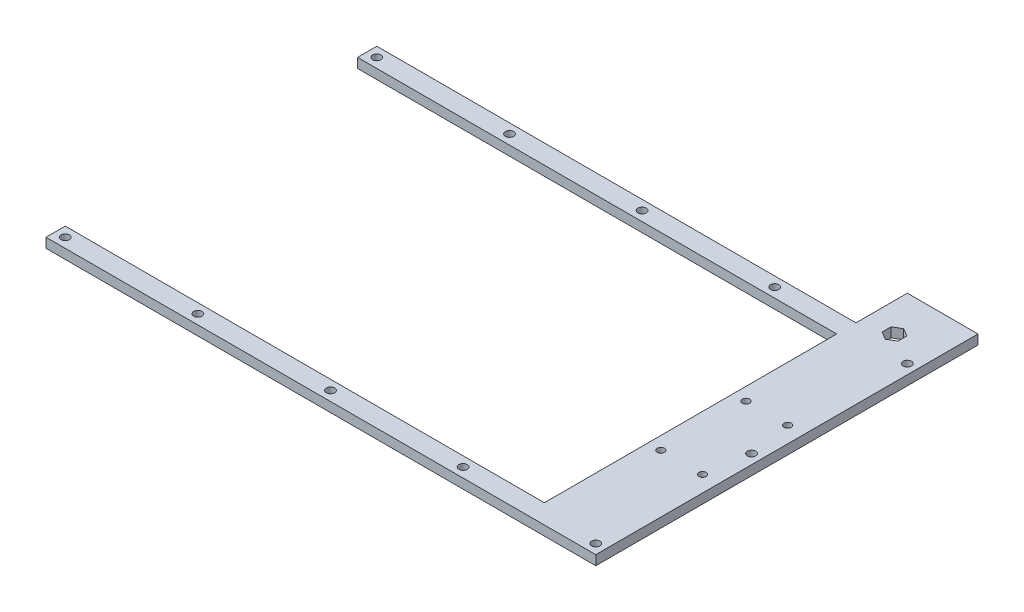
ISO-10303-21;
HEADER;
FILE_DESCRIPTION(('STEP AP214'),'2;1');
FILE_NAME('part.step','',(''),(''),'','','');
FILE_SCHEMA(('AUTOMOTIVE_DESIGN { 1 0 10303 214 1 1 1 1 }'));
ENDSEC;
DATA;
#1=APPLICATION_CONTEXT('core data for automotive mechanical design processes');
#2=APPLICATION_PROTOCOL_DEFINITION('international standard','automotive_design',2000,#1);
#3=PRODUCT_CONTEXT('',#1,'mechanical');
#4=PRODUCT('Part','Part','',(#3));
#5=PRODUCT_RELATED_PRODUCT_CATEGORY('part','',(#4));
#6=PRODUCT_DEFINITION_FORMATION('','',#4);
#7=PRODUCT_DEFINITION_CONTEXT('part definition',#1,'design');
#8=PRODUCT_DEFINITION('design','',#6,#7);
#9=PRODUCT_DEFINITION_SHAPE('','',#8);
#10=(LENGTH_UNIT() NAMED_UNIT(*) SI_UNIT(.MILLI.,.METRE.));
#11=(NAMED_UNIT(*) PLANE_ANGLE_UNIT() SI_UNIT($,.RADIAN.));
#12=(NAMED_UNIT(*) SI_UNIT($,.STERADIAN.) SOLID_ANGLE_UNIT());
#13=UNCERTAINTY_MEASURE_WITH_UNIT(LENGTH_MEASURE(1.E-05),#10,'distance_accuracy_value','');
#14=(GEOMETRIC_REPRESENTATION_CONTEXT(3) GLOBAL_UNCERTAINTY_ASSIGNED_CONTEXT((#13)) GLOBAL_UNIT_ASSIGNED_CONTEXT((#10,
#11,#12)) REPRESENTATION_CONTEXT('',''));
#15=CARTESIAN_POINT('',(0.,0.,0.));
#16=DIRECTION('',(0.,0.,1.));
#17=DIRECTION('',(1.,0.,0.));
#18=AXIS2_PLACEMENT_3D('',#15,#16,#17);
#19=CARTESIAN_POINT('',(49.9999999999999,-6.,109.921508101416));
#20=DIRECTION('',(0.,0.,1.));
#21=DIRECTION('',(1.,0.,0.));
#22=AXIS2_PLACEMENT_3D('',#19,#20,#21);
#23=PLANE('',#22);
#24=DIRECTION('',(0.,1.,0.));
#25=VECTOR('',#24,1.);
#26=CARTESIAN_POINT('',(5.99999999999987,-6.,109.921508101416));
#27=LINE('',#26,#25);
#28=CARTESIAN_POINT('',(5.99999999999987,-6.,109.921508101416));
#29=VERTEX_POINT('',#28);
#30=CARTESIAN_POINT('',(5.99999999999987,0.,109.921508101416));
#31=VERTEX_POINT('',#30);
#32=EDGE_CURVE('E221',#29,#31,#27,.T.);
#33=ORIENTED_EDGE('',*,*,#32,.F.);
#34=DIRECTION('',(-1.,0.,0.));
#35=VECTOR('',#34,1.);
#36=CARTESIAN_POINT('',(49.9999999999999,-6.,109.921508101416));
#37=LINE('',#36,#35);
#38=CARTESIAN_POINT('',(-292.3,-6.,109.921508101416));
#39=VERTEX_POINT('',#38);
#40=EDGE_CURVE('E308',#29,#39,#37,.T.);
#41=ORIENTED_EDGE('',*,*,#40,.T.);
#42=DIRECTION('',(0.,1.,0.));
#43=VECTOR('',#42,1.);
#44=CARTESIAN_POINT('',(-292.3,-6.,109.921508101416));
#45=LINE('',#44,#43);
#46=CARTESIAN_POINT('',(-292.3,0.,109.921508101416));
#47=VERTEX_POINT('',#46);
#48=EDGE_CURVE('E334',#39,#47,#45,.T.);
#49=ORIENTED_EDGE('',*,*,#48,.T.);
#50=DIRECTION('',(1.,0.,0.));
#51=VECTOR('',#50,1.);
#52=CARTESIAN_POINT('',(49.9999999999999,0.,109.921508101416));
#53=LINE('',#52,#51);
#54=EDGE_CURVE('E335',#47,#31,#53,.T.);
#55=ORIENTED_EDGE('',*,*,#54,.T.);
#56=EDGE_LOOP('',(#33,#41,#49,#55));
#57=FACE_BOUND('',#56,.T.);
#58=ADVANCED_FACE('F41',(#57),#23,.F.);
#59=CARTESIAN_POINT('',(0.,0.,0.));
#60=DIRECTION('',(0.,-1.,0.));
#61=DIRECTION('',(0.,0.,-1.));
#62=AXIS2_PLACEMENT_3D('',#59,#60,#61);
#63=PLANE('',#62);
#64=DIRECTION('',(0.866025403784444,0.,-0.49999999999999));
#65=VECTOR('',#64,1.);
#66=CARTESIAN_POINT('',(28.9099999999998,0.,106.756297923137));
#67=LINE('',#66,#65);
#68=CARTESIAN_POINT('',(23.9999999999998,0.,109.591087744858));
#69=VERTEX_POINT('',#68);
#70=CARTESIAN_POINT('',(28.9099999999998,0.,106.756297923137));
#71=VERTEX_POINT('',#70);
#72=EDGE_CURVE('E189',#69,#71,#67,.T.);
#73=ORIENTED_EDGE('',*,*,#72,.F.);
#74=DIRECTION('',(0.866025403784439,0.,0.499999999999999));
#75=VECTOR('',#74,1.);
#76=CARTESIAN_POINT('',(23.9999999999998,0.,109.591087744858));
#77=LINE('',#76,#75);
#78=CARTESIAN_POINT('',(19.0899999999998,0.,106.756297923137));
#79=VERTEX_POINT('',#78);
#80=EDGE_CURVE('E58',#79,#69,#77,.T.);
#81=ORIENTED_EDGE('',*,*,#80,.F.);
#82=DIRECTION('',(0.,0.,1.));
#83=VECTOR('',#82,1.);
#84=CARTESIAN_POINT('',(19.0899999999998,0.,106.756297923137));
#85=LINE('',#84,#83);
#86=CARTESIAN_POINT('',(19.0899999999998,0.,101.086718279695));
#87=VERTEX_POINT('',#86);
#88=EDGE_CURVE('E175',#87,#79,#85,.T.);
#89=ORIENTED_EDGE('',*,*,#88,.F.);
#90=DIRECTION('',(-0.86602540378444,0.,0.499999999999998));
#91=VECTOR('',#90,1.);
#92=CARTESIAN_POINT('',(19.0899999999998,0.,101.086718279695));
#93=LINE('',#92,#91);
#94=CARTESIAN_POINT('',(23.9999999999999,0.,98.2519284579738));
#95=VERTEX_POINT('',#94);
#96=EDGE_CURVE('E178',#95,#87,#93,.T.);
#97=ORIENTED_EDGE('',*,*,#96,.F.);
#98=DIRECTION('',(-0.866025403784434,0.,-0.500000000000009));
#99=VECTOR('',#98,1.);
#100=CARTESIAN_POINT('',(23.9999999999999,0.,98.2519284579738));
#101=LINE('',#100,#99);
#102=CARTESIAN_POINT('',(28.9099999999998,0.,101.086718279695));
#103=VERTEX_POINT('',#102);
#104=EDGE_CURVE('E194',#103,#95,#101,.T.);
#105=ORIENTED_EDGE('',*,*,#104,.F.);
#106=DIRECTION('',(0.,0.,-1.));
#107=VECTOR('',#106,1.);
#108=CARTESIAN_POINT('',(28.9099999999998,0.,101.086718279695));
#109=LINE('',#108,#107);
#110=EDGE_CURVE('E191',#71,#103,#109,.T.);
#111=ORIENTED_EDGE('',*,*,#110,.F.);
#112=EDGE_LOOP('',(#73,#81,#89,#97,#105,#111));
#113=FACE_BOUND('',#112,.T.);
#114=CARTESIAN_POINT('',(-286.3,0.,115.921508101416));
#115=DIRECTION('',(0.,1.,0.));
#116=DIRECTION('',(0.,0.,1.));
#117=AXIS2_PLACEMENT_3D('',#114,#115,#116);
#118=CIRCLE('',#117,2.59999999999999);
#119=CARTESIAN_POINT('',(-286.3,0.,118.521508101416));
#120=VERTEX_POINT('',#119);
#121=EDGE_CURVE('E224',#120,#120,#118,.T.);
#122=ORIENTED_EDGE('',*,*,#121,.F.);
#123=EDGE_LOOP('',(#122));
#124=FACE_BOUND('',#123,.T.);
#125=CARTESIAN_POINT('',(-203.725,0.,115.921508101416));
#126=DIRECTION('',(0.,1.,0.));
#127=DIRECTION('',(0.,0.,1.));
#128=AXIS2_PLACEMENT_3D('',#125,#126,#127);
#129=CIRCLE('',#128,2.59999999999999);
#130=CARTESIAN_POINT('',(-203.725,0.,118.521508101416));
#131=VERTEX_POINT('',#130);
#132=EDGE_CURVE('E234',#131,#131,#129,.T.);
#133=ORIENTED_EDGE('',*,*,#132,.F.);
#134=EDGE_LOOP('',(#133));
#135=FACE_BOUND('',#134,.T.);
#136=CARTESIAN_POINT('',(-121.15,0.,115.921508101416));
#137=DIRECTION('',(0.,1.,0.));
#138=DIRECTION('',(0.,0.,1.));
#139=AXIS2_PLACEMENT_3D('',#136,#137,#138);
#140=CIRCLE('',#139,2.6);
#141=CARTESIAN_POINT('',(-121.15,0.,118.521508101416));
#142=VERTEX_POINT('',#141);
#143=EDGE_CURVE('E240',#142,#142,#140,.T.);
#144=ORIENTED_EDGE('',*,*,#143,.F.);
#145=EDGE_LOOP('',(#144));
#146=FACE_BOUND('',#145,.T.);
#147=CARTESIAN_POINT('',(-38.575,0.,115.921508101416));
#148=DIRECTION('',(0.,1.,0.));
#149=DIRECTION('',(0.,0.,1.));
#150=AXIS2_PLACEMENT_3D('',#147,#148,#149);
#151=CIRCLE('',#150,2.6);
#152=CARTESIAN_POINT('',(-38.575,0.,118.521508101416));
#153=VERTEX_POINT('',#152);
#154=EDGE_CURVE('E246',#153,#153,#151,.T.);
#155=ORIENTED_EDGE('',*,*,#154,.F.);
#156=EDGE_LOOP('',(#155));
#157=FACE_BOUND('',#156,.T.);
#158=CARTESIAN_POINT('',(44.0000000000001,0.,115.921508101416));
#159=DIRECTION('',(0.,1.,0.));
#160=DIRECTION('',(0.,0.,1.));
#161=AXIS2_PLACEMENT_3D('',#158,#159,#160);
#162=CIRCLE('',#161,2.6);
#163=CARTESIAN_POINT('',(44.0000000000001,0.,118.521508101416));
#164=VERTEX_POINT('',#163);
#165=EDGE_CURVE('E252',#164,#164,#162,.T.);
#166=ORIENTED_EDGE('',*,*,#165,.F.);
#167=EDGE_LOOP('',(#166));
#168=FACE_BOUND('',#167,.T.);
#169=CARTESIAN_POINT('',(43.9999999999998,0.,309.921508101416));
#170=DIRECTION('',(0.,1.,0.));
#171=DIRECTION('',(0.,0.,1.));
#172=AXIS2_PLACEMENT_3D('',#169,#170,#171);
#173=CIRCLE('',#172,2.6);
#174=CARTESIAN_POINT('',(43.9999999999998,0.,312.521508101416));
#175=VERTEX_POINT('',#174);
#176=EDGE_CURVE('E258',#175,#175,#173,.T.);
#177=ORIENTED_EDGE('',*,*,#176,.F.);
#178=EDGE_LOOP('',(#177));
#179=FACE_BOUND('',#178,.T.);
#180=CARTESIAN_POINT('',(-38.5750000000002,0.,309.921508101416));
#181=DIRECTION('',(0.,1.,0.));
#182=DIRECTION('',(0.,0.,1.));
#183=AXIS2_PLACEMENT_3D('',#180,#181,#182);
#184=CIRCLE('',#183,2.6);
#185=CARTESIAN_POINT('',(-38.5750000000002,0.,312.521508101416));
#186=VERTEX_POINT('',#185);
#187=EDGE_CURVE('E264',#186,#186,#184,.T.);
#188=ORIENTED_EDGE('',*,*,#187,.F.);
#189=EDGE_LOOP('',(#188));
#190=FACE_BOUND('',#189,.T.);
#191=CARTESIAN_POINT('',(-121.15,0.,309.921508101416));
#192=DIRECTION('',(0.,1.,0.));
#193=DIRECTION('',(0.,0.,1.));
#194=AXIS2_PLACEMENT_3D('',#191,#192,#193);
#195=CIRCLE('',#194,2.6);
#196=CARTESIAN_POINT('',(-121.15,0.,312.521508101416));
#197=VERTEX_POINT('',#196);
#198=EDGE_CURVE('E270',#197,#197,#195,.T.);
#199=ORIENTED_EDGE('',*,*,#198,.F.);
#200=EDGE_LOOP('',(#199));
#201=FACE_BOUND('',#200,.T.);
#202=CARTESIAN_POINT('',(-203.725,0.,309.921508101416));
#203=DIRECTION('',(0.,1.,0.));
#204=DIRECTION('',(0.,0.,1.));
#205=AXIS2_PLACEMENT_3D('',#202,#203,#204);
#206=CIRCLE('',#205,2.59999999999999);
#207=CARTESIAN_POINT('',(-203.725,0.,312.521508101416));
#208=VERTEX_POINT('',#207);
#209=EDGE_CURVE('E276',#208,#208,#206,.T.);
#210=ORIENTED_EDGE('',*,*,#209,.F.);
#211=EDGE_LOOP('',(#210));
#212=FACE_BOUND('',#211,.T.);
#213=CARTESIAN_POINT('',(-286.3,0.,309.921508101416));
#214=DIRECTION('',(0.,1.,0.));
#215=DIRECTION('',(0.,0.,1.));
#216=AXIS2_PLACEMENT_3D('',#213,#214,#215);
#217=CIRCLE('',#216,2.59999999999999);
#218=CARTESIAN_POINT('',(-286.3,0.,312.521508101416));
#219=VERTEX_POINT('',#218);
#220=EDGE_CURVE('E282',#219,#219,#217,.T.);
#221=ORIENTED_EDGE('',*,*,#220,.F.);
#222=EDGE_LOOP('',(#221));
#223=FACE_BOUND('',#222,.T.);
#224=CARTESIAN_POINT('',(43.9999999999998,0.,212.921508101416));
#225=DIRECTION('',(0.,1.,0.));
#226=DIRECTION('',(0.,0.,1.));
#227=AXIS2_PLACEMENT_3D('',#224,#225,#226);
#228=CIRCLE('',#227,2.6);
#229=CARTESIAN_POINT('',(43.9999999999998,0.,215.521508101416));
#230=VERTEX_POINT('',#229);
#231=EDGE_CURVE('E288',#230,#230,#228,.T.);
#232=ORIENTED_EDGE('',*,*,#231,.F.);
#233=EDGE_LOOP('',(#232));
#234=FACE_BOUND('',#233,.T.);
#235=CARTESIAN_POINT('',(39.9999999999999,0.,239.421508101416));
#236=DIRECTION('',(0.,-1.,0.));
#237=DIRECTION('',(0.,0.,-1.));
#238=AXIS2_PLACEMENT_3D('',#235,#236,#237);
#239=CIRCLE('',#238,2.25);
#240=CARTESIAN_POINT('',(39.9999999999999,0.,237.171508101416));
#241=VERTEX_POINT('',#240);
#242=EDGE_CURVE('E304',#241,#241,#239,.F.);
#243=ORIENTED_EDGE('',*,*,#242,.F.);
#244=EDGE_LOOP('',(#243));
#245=FACE_BOUND('',#244,.T.);
#246=CARTESIAN_POINT('',(13.9999999999999,0.,186.421508101416));
#247=DIRECTION('',(0.,-1.,0.));
#248=DIRECTION('',(0.,0.,-1.));
#249=AXIS2_PLACEMENT_3D('',#246,#247,#248);
#250=CIRCLE('',#249,2.25);
#251=CARTESIAN_POINT('',(13.9999999999999,0.,184.171508101416));
#252=VERTEX_POINT('',#251);
#253=EDGE_CURVE('E313',#252,#252,#250,.F.);
#254=ORIENTED_EDGE('',*,*,#253,.F.);
#255=EDGE_LOOP('',(#254));
#256=FACE_BOUND('',#255,.T.);
#257=CARTESIAN_POINT('',(13.9999999999999,0.,239.421508101416));
#258=DIRECTION('',(0.,-1.,0.));
#259=DIRECTION('',(0.,0.,-1.));
#260=AXIS2_PLACEMENT_3D('',#257,#258,#259);
#261=CIRCLE('',#260,2.25);
#262=CARTESIAN_POINT('',(13.9999999999999,0.,237.171508101416));
#263=VERTEX_POINT('',#262);
#264=EDGE_CURVE('E317',#263,#263,#261,.F.);
#265=ORIENTED_EDGE('',*,*,#264,.F.);
#266=EDGE_LOOP('',(#265));
#267=FACE_BOUND('',#266,.T.);
#268=CARTESIAN_POINT('',(39.9999999999999,0.,186.421508101416));
#269=DIRECTION('',(0.,-1.,0.));
#270=DIRECTION('',(0.,0.,-1.));
#271=AXIS2_PLACEMENT_3D('',#268,#269,#270);
#272=CIRCLE('',#271,2.25);
#273=CARTESIAN_POINT('',(39.9999999999999,0.,184.171508101416));
#274=VERTEX_POINT('',#273);
#275=EDGE_CURVE('E309',#274,#274,#272,.F.);
#276=ORIENTED_EDGE('',*,*,#275,.F.);
#277=EDGE_LOOP('',(#276));
#278=FACE_BOUND('',#277,.T.);
#279=DIRECTION('',(-1.,0.,0.));
#280=VECTOR('',#279,1.);
#281=CARTESIAN_POINT('',(49.9999999999999,0.,315.921508101416));
#282=LINE('',#281,#280);
#283=CARTESIAN_POINT('',(49.9999999999999,0.,315.921508101416));
#284=VERTEX_POINT('',#283);
#285=CARTESIAN_POINT('',(-292.3,0.,315.921508101416));
#286=VERTEX_POINT('',#285);
#287=EDGE_CURVE('E11',#284,#286,#282,.T.);
#288=ORIENTED_EDGE('',*,*,#287,.F.);
#289=DIRECTION('',(0.,0.,1.));
#290=VECTOR('',#289,1.);
#291=CARTESIAN_POINT('',(49.9999999999999,0.,77.9215081014159));
#292=LINE('',#291,#290);
#293=CARTESIAN_POINT('',(49.9999999999999,0.,77.9215081014159));
#294=VERTEX_POINT('',#293);
#295=EDGE_CURVE('E301',#294,#284,#292,.T.);
#296=ORIENTED_EDGE('',*,*,#295,.F.);
#297=DIRECTION('',(-1.,0.,0.));
#298=VECTOR('',#297,1.);
#299=CARTESIAN_POINT('',(49.9999999999999,0.,77.9215081014159));
#300=LINE('',#299,#298);
#301=CARTESIAN_POINT('',(5.99999999999987,0.,77.9215081014159));
#302=VERTEX_POINT('',#301);
#303=EDGE_CURVE('E201',#294,#302,#300,.T.);
#304=ORIENTED_EDGE('',*,*,#303,.T.);
#305=DIRECTION('',(0.,0.,1.));
#306=VECTOR('',#305,1.);
#307=CARTESIAN_POINT('',(5.99999999999987,0.,109.921508101416));
#308=LINE('',#307,#306);
#309=EDGE_CURVE('E213',#302,#31,#308,.T.);
#310=ORIENTED_EDGE('',*,*,#309,.T.);
#311=ORIENTED_EDGE('',*,*,#54,.F.);
#312=DIRECTION('',(0.,0.,-1.));
#313=VECTOR('',#312,1.);
#314=CARTESIAN_POINT('',(-292.3,0.,77.9215081014159));
#315=LINE('',#314,#313);
#316=CARTESIAN_POINT('',(-292.3,0.,121.921508101416));
#317=VERTEX_POINT('',#316);
#318=EDGE_CURVE('E298',#317,#47,#315,.T.);
#319=ORIENTED_EDGE('',*,*,#318,.F.);
#320=DIRECTION('',(-1.,0.,0.));
#321=VECTOR('',#320,1.);
#322=CARTESIAN_POINT('',(5.99999999999995,0.,121.921508101416));
#323=LINE('',#322,#321);
#324=CARTESIAN_POINT('',(5.99999999999995,0.,121.921508101416));
#325=VERTEX_POINT('',#324);
#326=EDGE_CURVE('E337',#325,#317,#323,.T.);
#327=ORIENTED_EDGE('',*,*,#326,.F.);
#328=DIRECTION('',(0.,0.,-1.));
#329=VECTOR('',#328,1.);
#330=CARTESIAN_POINT('',(5.99999999999987,0.,303.921508101416));
#331=LINE('',#330,#329);
#332=CARTESIAN_POINT('',(5.99999999999987,0.,303.921508101416));
#333=VERTEX_POINT('',#332);
#334=EDGE_CURVE('E340',#333,#325,#331,.T.);
#335=ORIENTED_EDGE('',*,*,#334,.F.);
#336=DIRECTION('',(1.,0.,0.));
#337=VECTOR('',#336,1.);
#338=CARTESIAN_POINT('',(5.99999999999987,0.,303.921508101416));
#339=LINE('',#338,#337);
#340=CARTESIAN_POINT('',(-292.3,0.,303.921508101416));
#341=VERTEX_POINT('',#340);
#342=EDGE_CURVE('E50',#341,#333,#339,.T.);
#343=ORIENTED_EDGE('',*,*,#342,.F.);
#344=DIRECTION('',(0.,0.,-1.));
#345=VECTOR('',#344,1.);
#346=CARTESIAN_POINT('',(-292.3,0.,297.921508101416));
#347=LINE('',#346,#345);
#348=EDGE_CURVE('E294',#286,#341,#347,.T.);
#349=ORIENTED_EDGE('',*,*,#348,.F.);
#350=EDGE_LOOP('',(#288,#296,#304,#310,#311,#319,#327,#335,#343,#349));
#351=FACE_BOUND('',#350,.T.);
#352=ADVANCED_FACE('F397',(#113,#124,#135,#146,#157,#168,#179,#190,#201,#212,#223,#234,#245,
#256,#267,#278,#351),#63,.F.);
#353=CARTESIAN_POINT('',(0.,-6.,0.));
#354=DIRECTION('',(0.,1.,0.));
#355=DIRECTION('',(0.,0.,1.));
#356=AXIS2_PLACEMENT_3D('',#353,#354,#355);
#357=PLANE('',#356);
#358=DIRECTION('',(0.,0.,1.));
#359=VECTOR('',#358,1.);
#360=CARTESIAN_POINT('',(19.0899999999998,-6.00000000000001,106.756297923137));
#361=LINE('',#360,#359);
#362=CARTESIAN_POINT('',(19.0899999999998,-6.00000000000001,101.086718279695));
#363=VERTEX_POINT('',#362);
#364=CARTESIAN_POINT('',(19.0899999999998,-6.00000000000001,106.756297923137));
#365=VERTEX_POINT('',#364);
#366=EDGE_CURVE('E164',#363,#365,#361,.T.);
#367=ORIENTED_EDGE('',*,*,#366,.T.);
#368=DIRECTION('',(0.866025403784439,0.,0.499999999999999));
#369=VECTOR('',#368,1.);
#370=CARTESIAN_POINT('',(23.9999999999998,-6.00000000000001,109.591087744858));
#371=LINE('',#370,#369);
#372=CARTESIAN_POINT('',(23.9999999999998,-6.00000000000001,109.591087744858));
#373=VERTEX_POINT('',#372);
#374=EDGE_CURVE('E158',#365,#373,#371,.T.);
#375=ORIENTED_EDGE('',*,*,#374,.T.);
#376=DIRECTION('',(0.866025403784444,0.,-0.49999999999999));
#377=VECTOR('',#376,1.);
#378=CARTESIAN_POINT('',(28.9099999999998,-6.00000000000001,106.756297923137));
#379=LINE('',#378,#377);
#380=CARTESIAN_POINT('',(28.9099999999998,-6.,106.756297923137));
#381=VERTEX_POINT('',#380);
#382=EDGE_CURVE('E167',#373,#381,#379,.T.);
#383=ORIENTED_EDGE('',*,*,#382,.T.);
#384=DIRECTION('',(0.,0.,-1.));
#385=VECTOR('',#384,1.);
#386=CARTESIAN_POINT('',(28.9099999999998,-6.00000000000001,101.086718279695));
#387=LINE('',#386,#385);
#388=CARTESIAN_POINT('',(28.9099999999998,-6.00000000000001,101.086718279695));
#389=VERTEX_POINT('',#388);
#390=EDGE_CURVE('E66',#381,#389,#387,.T.);
#391=ORIENTED_EDGE('',*,*,#390,.T.);
#392=DIRECTION('',(-0.866025403784434,0.,-0.500000000000009));
#393=VECTOR('',#392,1.);
#394=CARTESIAN_POINT('',(23.9999999999999,-6.00000000000001,98.2519284579738));
#395=LINE('',#394,#393);
#396=CARTESIAN_POINT('',(23.9999999999999,-6.00000000000001,98.2519284579738));
#397=VERTEX_POINT('',#396);
#398=EDGE_CURVE('E182',#389,#397,#395,.T.);
#399=ORIENTED_EDGE('',*,*,#398,.T.);
#400=DIRECTION('',(-0.86602540378444,0.,0.499999999999998));
#401=VECTOR('',#400,1.);
#402=CARTESIAN_POINT('',(19.0899999999998,-6.00000000000001,101.086718279695));
#403=LINE('',#402,#401);
#404=EDGE_CURVE('E185',#397,#363,#403,.T.);
#405=ORIENTED_EDGE('',*,*,#404,.T.);
#406=EDGE_LOOP('',(#367,#375,#383,#391,#399,#405));
#407=FACE_BOUND('',#406,.T.);
#408=CARTESIAN_POINT('',(-286.3,-6.00000000000001,115.921508101416));
#409=DIRECTION('',(0.,1.,0.));
#410=DIRECTION('',(0.,0.,1.));
#411=AXIS2_PLACEMENT_3D('',#408,#409,#410);
#412=CIRCLE('',#411,2.59999999999999);
#413=CARTESIAN_POINT('',(-286.3,-6.00000000000001,118.521508101416));
#414=VERTEX_POINT('',#413);
#415=EDGE_CURVE('E231',#414,#414,#412,.T.);
#416=ORIENTED_EDGE('',*,*,#415,.T.);
#417=EDGE_LOOP('',(#416));
#418=FACE_BOUND('',#417,.T.);
#419=CARTESIAN_POINT('',(-203.725,-6.00000000000001,115.921508101416));
#420=DIRECTION('',(0.,1.,0.));
#421=DIRECTION('',(0.,0.,1.));
#422=AXIS2_PLACEMENT_3D('',#419,#420,#421);
#423=CIRCLE('',#422,2.59999999999999);
#424=CARTESIAN_POINT('',(-203.725,-6.00000000000001,118.521508101416));
#425=VERTEX_POINT('',#424);
#426=EDGE_CURVE('E237',#425,#425,#423,.T.);
#427=ORIENTED_EDGE('',*,*,#426,.T.);
#428=EDGE_LOOP('',(#427));
#429=FACE_BOUND('',#428,.T.);
#430=CARTESIAN_POINT('',(-121.15,-6.00000000000001,115.921508101416));
#431=DIRECTION('',(0.,1.,0.));
#432=DIRECTION('',(0.,0.,1.));
#433=AXIS2_PLACEMENT_3D('',#430,#431,#432);
#434=CIRCLE('',#433,2.6);
#435=CARTESIAN_POINT('',(-121.15,-6.00000000000001,118.521508101416));
#436=VERTEX_POINT('',#435);
#437=EDGE_CURVE('E243',#436,#436,#434,.T.);
#438=ORIENTED_EDGE('',*,*,#437,.T.);
#439=EDGE_LOOP('',(#438));
#440=FACE_BOUND('',#439,.T.);
#441=CARTESIAN_POINT('',(-38.575,-6.00000000000001,115.921508101416));
#442=DIRECTION('',(0.,1.,0.));
#443=DIRECTION('',(0.,0.,1.));
#444=AXIS2_PLACEMENT_3D('',#441,#442,#443);
#445=CIRCLE('',#444,2.6);
#446=CARTESIAN_POINT('',(-38.575,-6.00000000000001,118.521508101416));
#447=VERTEX_POINT('',#446);
#448=EDGE_CURVE('E249',#447,#447,#445,.T.);
#449=ORIENTED_EDGE('',*,*,#448,.T.);
#450=EDGE_LOOP('',(#449));
#451=FACE_BOUND('',#450,.T.);
#452=CARTESIAN_POINT('',(44.0000000000001,-6.00000000000001,115.921508101416));
#453=DIRECTION('',(0.,1.,0.));
#454=DIRECTION('',(0.,0.,1.));
#455=AXIS2_PLACEMENT_3D('',#452,#453,#454);
#456=CIRCLE('',#455,2.6);
#457=CARTESIAN_POINT('',(44.0000000000001,-6.00000000000001,118.521508101416));
#458=VERTEX_POINT('',#457);
#459=EDGE_CURVE('E255',#458,#458,#456,.T.);
#460=ORIENTED_EDGE('',*,*,#459,.T.);
#461=EDGE_LOOP('',(#460));
#462=FACE_BOUND('',#461,.T.);
#463=CARTESIAN_POINT('',(43.9999999999998,-6.00000000000001,309.921508101416));
#464=DIRECTION('',(0.,1.,0.));
#465=DIRECTION('',(0.,0.,1.));
#466=AXIS2_PLACEMENT_3D('',#463,#464,#465);
#467=CIRCLE('',#466,2.6);
#468=CARTESIAN_POINT('',(43.9999999999998,-6.00000000000001,312.521508101416));
#469=VERTEX_POINT('',#468);
#470=EDGE_CURVE('E261',#469,#469,#467,.T.);
#471=ORIENTED_EDGE('',*,*,#470,.T.);
#472=EDGE_LOOP('',(#471));
#473=FACE_BOUND('',#472,.T.);
#474=CARTESIAN_POINT('',(-38.5750000000002,-6.00000000000001,309.921508101416));
#475=DIRECTION('',(0.,1.,0.));
#476=DIRECTION('',(0.,0.,1.));
#477=AXIS2_PLACEMENT_3D('',#474,#475,#476);
#478=CIRCLE('',#477,2.6);
#479=CARTESIAN_POINT('',(-38.5750000000002,-6.00000000000001,312.521508101416));
#480=VERTEX_POINT('',#479);
#481=EDGE_CURVE('E267',#480,#480,#478,.T.);
#482=ORIENTED_EDGE('',*,*,#481,.T.);
#483=EDGE_LOOP('',(#482));
#484=FACE_BOUND('',#483,.T.);
#485=CARTESIAN_POINT('',(-121.15,-6.00000000000001,309.921508101416));
#486=DIRECTION('',(0.,1.,0.));
#487=DIRECTION('',(0.,0.,1.));
#488=AXIS2_PLACEMENT_3D('',#485,#486,#487);
#489=CIRCLE('',#488,2.6);
#490=CARTESIAN_POINT('',(-121.15,-6.00000000000001,312.521508101416));
#491=VERTEX_POINT('',#490);
#492=EDGE_CURVE('E273',#491,#491,#489,.T.);
#493=ORIENTED_EDGE('',*,*,#492,.T.);
#494=EDGE_LOOP('',(#493));
#495=FACE_BOUND('',#494,.T.);
#496=CARTESIAN_POINT('',(-203.725,-6.00000000000001,309.921508101416));
#497=DIRECTION('',(0.,1.,0.));
#498=DIRECTION('',(0.,0.,1.));
#499=AXIS2_PLACEMENT_3D('',#496,#497,#498);
#500=CIRCLE('',#499,2.59999999999999);
#501=CARTESIAN_POINT('',(-203.725,-6.00000000000001,312.521508101416));
#502=VERTEX_POINT('',#501);
#503=EDGE_CURVE('E279',#502,#502,#500,.T.);
#504=ORIENTED_EDGE('',*,*,#503,.T.);
#505=EDGE_LOOP('',(#504));
#506=FACE_BOUND('',#505,.T.);
#507=CARTESIAN_POINT('',(-286.3,-6.00000000000001,309.921508101416));
#508=DIRECTION('',(0.,1.,0.));
#509=DIRECTION('',(0.,0.,1.));
#510=AXIS2_PLACEMENT_3D('',#507,#508,#509);
#511=CIRCLE('',#510,2.59999999999999);
#512=CARTESIAN_POINT('',(-286.3,-6.00000000000001,312.521508101416));
#513=VERTEX_POINT('',#512);
#514=EDGE_CURVE('E285',#513,#513,#511,.T.);
#515=ORIENTED_EDGE('',*,*,#514,.T.);
#516=EDGE_LOOP('',(#515));
#517=FACE_BOUND('',#516,.T.);
#518=CARTESIAN_POINT('',(43.9999999999998,-6.00000000000001,212.921508101416));
#519=DIRECTION('',(0.,1.,0.));
#520=DIRECTION('',(0.,0.,1.));
#521=AXIS2_PLACEMENT_3D('',#518,#519,#520);
#522=CIRCLE('',#521,2.6);
#523=CARTESIAN_POINT('',(43.9999999999998,-6.00000000000001,215.521508101416));
#524=VERTEX_POINT('',#523);
#525=EDGE_CURVE('E291',#524,#524,#522,.T.);
#526=ORIENTED_EDGE('',*,*,#525,.T.);
#527=EDGE_LOOP('',(#526));
#528=FACE_BOUND('',#527,.T.);
#529=CARTESIAN_POINT('',(39.9999999999999,-6.,239.421508101416));
#530=DIRECTION('',(0.,1.,0.));
#531=DIRECTION('',(0.,0.,1.));
#532=AXIS2_PLACEMENT_3D('',#529,#530,#531);
#533=CIRCLE('',#532,2.25);
#534=CARTESIAN_POINT('',(39.9999999999999,-6.,241.671508101416));
#535=VERTEX_POINT('',#534);
#536=EDGE_CURVE('E307',#535,#535,#533,.F.);
#537=ORIENTED_EDGE('',*,*,#536,.F.);
#538=EDGE_LOOP('',(#537));
#539=FACE_BOUND('',#538,.T.);
#540=CARTESIAN_POINT('',(13.9999999999999,-6.,186.421508101416));
#541=DIRECTION('',(0.,1.,0.));
#542=DIRECTION('',(0.,0.,1.));
#543=AXIS2_PLACEMENT_3D('',#540,#541,#542);
#544=CIRCLE('',#543,2.25);
#545=CARTESIAN_POINT('',(13.9999999999999,-6.,188.671508101416));
#546=VERTEX_POINT('',#545);
#547=EDGE_CURVE('E316',#546,#546,#544,.F.);
#548=ORIENTED_EDGE('',*,*,#547,.F.);
#549=EDGE_LOOP('',(#548));
#550=FACE_BOUND('',#549,.T.);
#551=CARTESIAN_POINT('',(13.9999999999999,-6.,239.421508101416));
#552=DIRECTION('',(0.,1.,0.));
#553=DIRECTION('',(0.,0.,1.));
#554=AXIS2_PLACEMENT_3D('',#551,#552,#553);
#555=CIRCLE('',#554,2.25);
#556=CARTESIAN_POINT('',(13.9999999999999,-6.,241.671508101416));
#557=VERTEX_POINT('',#556);
#558=EDGE_CURVE('E320',#557,#557,#555,.F.);
#559=ORIENTED_EDGE('',*,*,#558,.F.);
#560=EDGE_LOOP('',(#559));
#561=FACE_BOUND('',#560,.T.);
#562=CARTESIAN_POINT('',(39.9999999999999,-6.,186.421508101416));
#563=DIRECTION('',(0.,1.,0.));
#564=DIRECTION('',(0.,0.,1.));
#565=AXIS2_PLACEMENT_3D('',#562,#563,#564);
#566=CIRCLE('',#565,2.25);
#567=CARTESIAN_POINT('',(39.9999999999999,-6.,188.671508101416));
#568=VERTEX_POINT('',#567);
#569=EDGE_CURVE('E312',#568,#568,#566,.F.);
#570=ORIENTED_EDGE('',*,*,#569,.F.);
#571=EDGE_LOOP('',(#570));
#572=FACE_BOUND('',#571,.T.);
#573=DIRECTION('',(1.,0.,0.));
#574=VECTOR('',#573,1.);
#575=CARTESIAN_POINT('',(5.99999999999987,-6.,303.921508101416));
#576=LINE('',#575,#574);
#577=CARTESIAN_POINT('',(-292.3,-6.,303.921508101416));
#578=VERTEX_POINT('',#577);
#579=CARTESIAN_POINT('',(5.99999999999987,-6.,303.921508101416));
#580=VERTEX_POINT('',#579);
#581=EDGE_CURVE('E45',#578,#580,#576,.T.);
#582=ORIENTED_EDGE('',*,*,#581,.T.);
#583=DIRECTION('',(0.,0.,-1.));
#584=VECTOR('',#583,1.);
#585=CARTESIAN_POINT('',(5.99999999999987,-6.,303.921508101416));
#586=LINE('',#585,#584);
#587=CARTESIAN_POINT('',(5.99999999999995,-6.,121.921508101416));
#588=VERTEX_POINT('',#587);
#589=EDGE_CURVE('E364',#580,#588,#586,.T.);
#590=ORIENTED_EDGE('',*,*,#589,.T.);
#591=DIRECTION('',(-1.,0.,0.));
#592=VECTOR('',#591,1.);
#593=CARTESIAN_POINT('',(5.99999999999995,-6.,121.921508101416));
#594=LINE('',#593,#592);
#595=CARTESIAN_POINT('',(-292.3,-6.,121.921508101416));
#596=VERTEX_POINT('',#595);
#597=EDGE_CURVE('E300',#588,#596,#594,.T.);
#598=ORIENTED_EDGE('',*,*,#597,.T.);
#599=DIRECTION('',(0.,0.,1.));
#600=VECTOR('',#599,1.);
#601=CARTESIAN_POINT('',(-292.3,-6.,77.9215081014159));
#602=LINE('',#601,#600);
#603=EDGE_CURVE('E297',#39,#596,#602,.T.);
#604=ORIENTED_EDGE('',*,*,#603,.F.);
#605=ORIENTED_EDGE('',*,*,#40,.F.);
#606=DIRECTION('',(0.,0.,1.));
#607=VECTOR('',#606,1.);
#608=CARTESIAN_POINT('',(5.99999999999987,-6.,109.921508101416));
#609=LINE('',#608,#607);
#610=CARTESIAN_POINT('',(5.99999999999987,-6.,77.9215081014159));
#611=VERTEX_POINT('',#610);
#612=EDGE_CURVE('E212',#611,#29,#609,.T.);
#613=ORIENTED_EDGE('',*,*,#612,.F.);
#614=DIRECTION('',(-1.,0.,0.));
#615=VECTOR('',#614,1.);
#616=CARTESIAN_POINT('',(49.9999999999999,-6.,77.9215081014159));
#617=LINE('',#616,#615);
#618=CARTESIAN_POINT('',(49.9999999999999,-6.,77.9215081014159));
#619=VERTEX_POINT('',#618);
#620=EDGE_CURVE('E209',#619,#611,#617,.T.);
#621=ORIENTED_EDGE('',*,*,#620,.F.);
#622=DIRECTION('',(0.,0.,-1.));
#623=VECTOR('',#622,1.);
#624=CARTESIAN_POINT('',(49.9999999999999,-6.,77.9215081014159));
#625=LINE('',#624,#623);
#626=CARTESIAN_POINT('',(49.9999999999999,-6.,315.921508101416));
#627=VERTEX_POINT('',#626);
#628=EDGE_CURVE('E303',#627,#619,#625,.T.);
#629=ORIENTED_EDGE('',*,*,#628,.F.);
#630=DIRECTION('',(1.,0.,0.));
#631=VECTOR('',#630,1.);
#632=CARTESIAN_POINT('',(49.9999999999999,-6.,315.921508101416));
#633=LINE('',#632,#631);
#634=CARTESIAN_POINT('',(-292.3,-6.,315.921508101416));
#635=VERTEX_POINT('',#634);
#636=EDGE_CURVE('E352',#635,#627,#633,.T.);
#637=ORIENTED_EDGE('',*,*,#636,.F.);
#638=DIRECTION('',(0.,0.,1.));
#639=VECTOR('',#638,1.);
#640=CARTESIAN_POINT('',(-292.3,-6.,297.921508101416));
#641=LINE('',#640,#639);
#642=EDGE_CURVE('E296',#578,#635,#641,.T.);
#643=ORIENTED_EDGE('',*,*,#642,.F.);
#644=EDGE_LOOP('',(#582,#590,#598,#604,#605,#613,#621,#629,#637,#643));
#645=FACE_BOUND('',#644,.T.);
#646=ADVANCED_FACE('F171',(#407,#418,#429,#440,#451,#462,#473,#484,#495,#506,#517,#528,#539,
#550,#561,#572,#645),#357,.F.);
#647=CARTESIAN_POINT('',(13.9999999999999,6.,239.421508101416));
#648=DIRECTION('',(0.,-1.,0.));
#649=DIRECTION('',(0.,0.,-1.));
#650=AXIS2_PLACEMENT_3D('',#647,#648,#649);
#651=CYLINDRICAL_SURFACE('',#650,2.25);
#652=ORIENTED_EDGE('',*,*,#264,.T.);
#653=EDGE_LOOP('',(#652));
#654=FACE_BOUND('',#653,.T.);
#655=ORIENTED_EDGE('',*,*,#558,.T.);
#656=EDGE_LOOP('',(#655));
#657=FACE_BOUND('',#656,.T.);
#658=ADVANCED_FACE('F445',(#654,#657),#651,.F.);
#659=CARTESIAN_POINT('',(13.9999999999999,6.,186.421508101416));
#660=DIRECTION('',(0.,-1.,0.));
#661=DIRECTION('',(0.,0.,-1.));
#662=AXIS2_PLACEMENT_3D('',#659,#660,#661);
#663=CYLINDRICAL_SURFACE('',#662,2.25);
#664=ORIENTED_EDGE('',*,*,#253,.T.);
#665=EDGE_LOOP('',(#664));
#666=FACE_BOUND('',#665,.T.);
#667=ORIENTED_EDGE('',*,*,#547,.T.);
#668=EDGE_LOOP('',(#667));
#669=FACE_BOUND('',#668,.T.);
#670=ADVANCED_FACE('F466',(#666,#669),#663,.F.);
#671=CARTESIAN_POINT('',(39.9999999999999,6.,186.421508101416));
#672=DIRECTION('',(0.,-1.,0.));
#673=DIRECTION('',(0.,0.,-1.));
#674=AXIS2_PLACEMENT_3D('',#671,#672,#673);
#675=CYLINDRICAL_SURFACE('',#674,2.25);
#676=ORIENTED_EDGE('',*,*,#275,.T.);
#677=EDGE_LOOP('',(#676));
#678=FACE_BOUND('',#677,.T.);
#679=ORIENTED_EDGE('',*,*,#569,.T.);
#680=EDGE_LOOP('',(#679));
#681=FACE_BOUND('',#680,.T.);
#682=ADVANCED_FACE('F419',(#678,#681),#675,.F.);
#683=CARTESIAN_POINT('',(39.9999999999999,6.,239.421508101416));
#684=DIRECTION('',(0.,-1.,0.));
#685=DIRECTION('',(0.,0.,-1.));
#686=AXIS2_PLACEMENT_3D('',#683,#684,#685);
#687=CYLINDRICAL_SURFACE('',#686,2.25);
#688=ORIENTED_EDGE('',*,*,#242,.T.);
#689=EDGE_LOOP('',(#688));
#690=FACE_BOUND('',#689,.T.);
#691=ORIENTED_EDGE('',*,*,#536,.T.);
#692=EDGE_LOOP('',(#691));
#693=FACE_BOUND('',#692,.T.);
#694=ADVANCED_FACE('F43',(#690,#693),#687,.F.);
#695=CARTESIAN_POINT('',(-292.3,6.,297.921508101416));
#696=DIRECTION('',(1.,0.,0.));
#697=DIRECTION('',(0.,0.,-1.));
#698=AXIS2_PLACEMENT_3D('',#695,#696,#697);
#699=PLANE('',#698);
#700=DIRECTION('',(0.,1.,0.));
#701=VECTOR('',#700,1.);
#702=CARTESIAN_POINT('',(-292.3,-6.,315.921508101416));
#703=LINE('',#702,#701);
#704=EDGE_CURVE('E325',#635,#286,#703,.T.);
#705=ORIENTED_EDGE('',*,*,#704,.T.);
#706=ORIENTED_EDGE('',*,*,#348,.T.);
#707=DIRECTION('',(0.,1.,0.));
#708=VECTOR('',#707,1.);
#709=CARTESIAN_POINT('',(-292.3,-6.,303.921508101416));
#710=LINE('',#709,#708);
#711=EDGE_CURVE('E321',#578,#341,#710,.T.);
#712=ORIENTED_EDGE('',*,*,#711,.F.);
#713=ORIENTED_EDGE('',*,*,#642,.T.);
#714=EDGE_LOOP('',(#705,#706,#712,#713));
#715=FACE_BOUND('',#714,.T.);
#716=ADVANCED_FACE('F411',(#715),#699,.F.);
#717=CARTESIAN_POINT('',(5.99999999999987,-6.,303.921508101416));
#718=DIRECTION('',(0.,0.,1.));
#719=DIRECTION('',(1.,0.,0.));
#720=AXIS2_PLACEMENT_3D('',#717,#718,#719);
#721=PLANE('',#720);
#722=ORIENTED_EDGE('',*,*,#342,.T.);
#723=DIRECTION('',(0.,1.,0.));
#724=VECTOR('',#723,1.);
#725=CARTESIAN_POINT('',(5.99999999999987,-6.,303.921508101416));
#726=LINE('',#725,#724);
#727=EDGE_CURVE('E324',#580,#333,#726,.T.);
#728=ORIENTED_EDGE('',*,*,#727,.F.);
#729=ORIENTED_EDGE('',*,*,#581,.F.);
#730=ORIENTED_EDGE('',*,*,#711,.T.);
#731=EDGE_LOOP('',(#722,#728,#729,#730));
#732=FACE_BOUND('',#731,.T.);
#733=ADVANCED_FACE('F374',(#732),#721,.F.);
#734=CARTESIAN_POINT('',(5.99999999999987,-6.,303.921508101416));
#735=DIRECTION('',(1.,0.,0.));
#736=DIRECTION('',(0.,0.,-1.));
#737=AXIS2_PLACEMENT_3D('',#734,#735,#736);
#738=PLANE('',#737);
#739=ORIENTED_EDGE('',*,*,#334,.T.);
#740=DIRECTION('',(0.,1.,0.));
#741=VECTOR('',#740,1.);
#742=CARTESIAN_POINT('',(5.99999999999995,-6.,121.921508101416));
#743=LINE('',#742,#741);
#744=EDGE_CURVE('E328',#588,#325,#743,.T.);
#745=ORIENTED_EDGE('',*,*,#744,.F.);
#746=ORIENTED_EDGE('',*,*,#589,.F.);
#747=ORIENTED_EDGE('',*,*,#727,.T.);
#748=EDGE_LOOP('',(#739,#745,#746,#747));
#749=FACE_BOUND('',#748,.T.);
#750=ADVANCED_FACE('F378',(#749),#738,.F.);
#751=CARTESIAN_POINT('',(-292.3,6.,77.9215081014159));
#752=DIRECTION('',(1.,0.,0.));
#753=DIRECTION('',(0.,0.,-1.));
#754=AXIS2_PLACEMENT_3D('',#751,#752,#753);
#755=PLANE('',#754);
#756=DIRECTION('',(0.,1.,0.));
#757=VECTOR('',#756,1.);
#758=CARTESIAN_POINT('',(-292.3,-6.,121.921508101416));
#759=LINE('',#758,#757);
#760=EDGE_CURVE('E331',#596,#317,#759,.T.);
#761=ORIENTED_EDGE('',*,*,#760,.T.);
#762=ORIENTED_EDGE('',*,*,#318,.T.);
#763=ORIENTED_EDGE('',*,*,#48,.F.);
#764=ORIENTED_EDGE('',*,*,#603,.T.);
#765=EDGE_LOOP('',(#761,#762,#763,#764));
#766=FACE_BOUND('',#765,.T.);
#767=ADVANCED_FACE('F389',(#766),#755,.F.);
#768=CARTESIAN_POINT('',(5.99999999999995,-6.,121.921508101416));
#769=DIRECTION('',(0.,0.,-1.));
#770=DIRECTION('',(-1.,0.,0.));
#771=AXIS2_PLACEMENT_3D('',#768,#769,#770);
#772=PLANE('',#771);
#773=ORIENTED_EDGE('',*,*,#326,.T.);
#774=ORIENTED_EDGE('',*,*,#760,.F.);
#775=ORIENTED_EDGE('',*,*,#597,.F.);
#776=ORIENTED_EDGE('',*,*,#744,.T.);
#777=EDGE_LOOP('',(#773,#774,#775,#776));
#778=FACE_BOUND('',#777,.T.);
#779=ADVANCED_FACE('F381',(#778),#772,.F.);
#780=CARTESIAN_POINT('',(49.9999999999999,6.,77.9215081014159));
#781=DIRECTION('',(-1.,0.,0.));
#782=DIRECTION('',(0.,0.,1.));
#783=AXIS2_PLACEMENT_3D('',#780,#781,#782);
#784=PLANE('',#783);
#785=ORIENTED_EDGE('',*,*,#628,.T.);
#786=DIRECTION('',(0.,1.,0.));
#787=VECTOR('',#786,1.);
#788=CARTESIAN_POINT('',(49.9999999999999,-6.,77.9215081014159));
#789=LINE('',#788,#787);
#790=EDGE_CURVE('E216',#619,#294,#789,.T.);
#791=ORIENTED_EDGE('',*,*,#790,.T.);
#792=ORIENTED_EDGE('',*,*,#295,.T.);
#793=DIRECTION('',(0.,1.,0.));
#794=VECTOR('',#793,1.);
#795=CARTESIAN_POINT('',(49.9999999999999,-6.,315.921508101416));
#796=LINE('',#795,#794);
#797=EDGE_CURVE('E338',#627,#284,#796,.T.);
#798=ORIENTED_EDGE('',*,*,#797,.F.);
#799=EDGE_LOOP('',(#785,#791,#792,#798));
#800=FACE_BOUND('',#799,.T.);
#801=ADVANCED_FACE('F407',(#800),#784,.F.);
#802=CARTESIAN_POINT('',(49.9999999999999,-6.,315.921508101416));
#803=DIRECTION('',(0.,0.,-1.));
#804=DIRECTION('',(-1.,0.,0.));
#805=AXIS2_PLACEMENT_3D('',#802,#803,#804);
#806=PLANE('',#805);
#807=ORIENTED_EDGE('',*,*,#704,.F.);
#808=ORIENTED_EDGE('',*,*,#636,.T.);
#809=ORIENTED_EDGE('',*,*,#797,.T.);
#810=ORIENTED_EDGE('',*,*,#287,.T.);
#811=EDGE_LOOP('',(#807,#808,#809,#810));
#812=FACE_BOUND('',#811,.T.);
#813=ADVANCED_FACE('F409',(#812),#806,.F.);
#814=CARTESIAN_POINT('',(43.9999999999998,0.,212.921508101416));
#815=DIRECTION('',(0.,1.,0.));
#816=DIRECTION('',(0.,0.,1.));
#817=AXIS2_PLACEMENT_3D('',#814,#815,#816);
#818=CYLINDRICAL_SURFACE('',#817,2.6);
#819=ORIENTED_EDGE('',*,*,#525,.F.);
#820=EDGE_LOOP('',(#819));
#821=FACE_BOUND('',#820,.T.);
#822=ORIENTED_EDGE('',*,*,#231,.T.);
#823=EDGE_LOOP('',(#822));
#824=FACE_BOUND('',#823,.T.);
#825=ADVANCED_FACE('F450',(#821,#824),#818,.F.);
#826=CARTESIAN_POINT('',(-286.3,0.,309.921508101416));
#827=DIRECTION('',(0.,1.,0.));
#828=DIRECTION('',(0.,0.,1.));
#829=AXIS2_PLACEMENT_3D('',#826,#827,#828);
#830=CYLINDRICAL_SURFACE('',#829,2.59999999999999);
#831=ORIENTED_EDGE('',*,*,#514,.F.);
#832=EDGE_LOOP('',(#831));
#833=FACE_BOUND('',#832,.T.);
#834=ORIENTED_EDGE('',*,*,#220,.T.);
#835=EDGE_LOOP('',(#834));
#836=FACE_BOUND('',#835,.T.);
#837=ADVANCED_FACE('F454',(#833,#836),#830,.F.);
#838=CARTESIAN_POINT('',(-203.725,0.,309.921508101416));
#839=DIRECTION('',(0.,1.,0.));
#840=DIRECTION('',(0.,0.,1.));
#841=AXIS2_PLACEMENT_3D('',#838,#839,#840);
#842=CYLINDRICAL_SURFACE('',#841,2.59999999999999);
#843=ORIENTED_EDGE('',*,*,#503,.F.);
#844=EDGE_LOOP('',(#843));
#845=FACE_BOUND('',#844,.T.);
#846=ORIENTED_EDGE('',*,*,#209,.T.);
#847=EDGE_LOOP('',(#846));
#848=FACE_BOUND('',#847,.T.);
#849=ADVANCED_FACE('F460',(#845,#848),#842,.F.);
#850=CARTESIAN_POINT('',(-121.15,0.,309.921508101416));
#851=DIRECTION('',(0.,1.,0.));
#852=DIRECTION('',(0.,0.,1.));
#853=AXIS2_PLACEMENT_3D('',#850,#851,#852);
#854=CYLINDRICAL_SURFACE('',#853,2.6);
#855=ORIENTED_EDGE('',*,*,#492,.F.);
#856=EDGE_LOOP('',(#855));
#857=FACE_BOUND('',#856,.T.);
#858=ORIENTED_EDGE('',*,*,#198,.T.);
#859=EDGE_LOOP('',(#858));
#860=FACE_BOUND('',#859,.T.);
#861=ADVANCED_FACE('F572',(#857,#860),#854,.F.);
#862=CARTESIAN_POINT('',(-38.5750000000002,0.,309.921508101416));
#863=DIRECTION('',(0.,1.,0.));
#864=DIRECTION('',(0.,0.,1.));
#865=AXIS2_PLACEMENT_3D('',#862,#863,#864);
#866=CYLINDRICAL_SURFACE('',#865,2.6);
#867=ORIENTED_EDGE('',*,*,#481,.F.);
#868=EDGE_LOOP('',(#867));
#869=FACE_BOUND('',#868,.T.);
#870=ORIENTED_EDGE('',*,*,#187,.T.);
#871=EDGE_LOOP('',(#870));
#872=FACE_BOUND('',#871,.T.);
#873=ADVANCED_FACE('F582',(#869,#872),#866,.F.);
#874=CARTESIAN_POINT('',(43.9999999999998,0.,309.921508101416));
#875=DIRECTION('',(0.,1.,0.));
#876=DIRECTION('',(0.,0.,1.));
#877=AXIS2_PLACEMENT_3D('',#874,#875,#876);
#878=CYLINDRICAL_SURFACE('',#877,2.6);
#879=ORIENTED_EDGE('',*,*,#470,.F.);
#880=EDGE_LOOP('',(#879));
#881=FACE_BOUND('',#880,.T.);
#882=ORIENTED_EDGE('',*,*,#176,.T.);
#883=EDGE_LOOP('',(#882));
#884=FACE_BOUND('',#883,.T.);
#885=ADVANCED_FACE('F592',(#881,#884),#878,.F.);
#886=CARTESIAN_POINT('',(44.0000000000001,0.,115.921508101416));
#887=DIRECTION('',(0.,1.,0.));
#888=DIRECTION('',(0.,0.,1.));
#889=AXIS2_PLACEMENT_3D('',#886,#887,#888);
#890=CYLINDRICAL_SURFACE('',#889,2.6);
#891=ORIENTED_EDGE('',*,*,#459,.F.);
#892=EDGE_LOOP('',(#891));
#893=FACE_BOUND('',#892,.T.);
#894=ORIENTED_EDGE('',*,*,#165,.T.);
#895=EDGE_LOOP('',(#894));
#896=FACE_BOUND('',#895,.T.);
#897=ADVANCED_FACE('F602',(#893,#896),#890,.F.);
#898=CARTESIAN_POINT('',(-38.575,0.,115.921508101416));
#899=DIRECTION('',(0.,1.,0.));
#900=DIRECTION('',(0.,0.,1.));
#901=AXIS2_PLACEMENT_3D('',#898,#899,#900);
#902=CYLINDRICAL_SURFACE('',#901,2.6);
#903=ORIENTED_EDGE('',*,*,#448,.F.);
#904=EDGE_LOOP('',(#903));
#905=FACE_BOUND('',#904,.T.);
#906=ORIENTED_EDGE('',*,*,#154,.T.);
#907=EDGE_LOOP('',(#906));
#908=FACE_BOUND('',#907,.T.);
#909=ADVANCED_FACE('F612',(#905,#908),#902,.F.);
#910=CARTESIAN_POINT('',(-121.15,0.,115.921508101416));
#911=DIRECTION('',(0.,1.,0.));
#912=DIRECTION('',(0.,0.,1.));
#913=AXIS2_PLACEMENT_3D('',#910,#911,#912);
#914=CYLINDRICAL_SURFACE('',#913,2.6);
#915=ORIENTED_EDGE('',*,*,#437,.F.);
#916=EDGE_LOOP('',(#915));
#917=FACE_BOUND('',#916,.T.);
#918=ORIENTED_EDGE('',*,*,#143,.T.);
#919=EDGE_LOOP('',(#918));
#920=FACE_BOUND('',#919,.T.);
#921=ADVANCED_FACE('F622',(#917,#920),#914,.F.);
#922=CARTESIAN_POINT('',(-203.725,0.,115.921508101416));
#923=DIRECTION('',(0.,1.,0.));
#924=DIRECTION('',(0.,0.,1.));
#925=AXIS2_PLACEMENT_3D('',#922,#923,#924);
#926=CYLINDRICAL_SURFACE('',#925,2.59999999999999);
#927=ORIENTED_EDGE('',*,*,#426,.F.);
#928=EDGE_LOOP('',(#927));
#929=FACE_BOUND('',#928,.T.);
#930=ORIENTED_EDGE('',*,*,#132,.T.);
#931=EDGE_LOOP('',(#930));
#932=FACE_BOUND('',#931,.T.);
#933=ADVANCED_FACE('F632',(#929,#932),#926,.F.);
#934=CARTESIAN_POINT('',(-286.3,0.,115.921508101416));
#935=DIRECTION('',(0.,1.,0.));
#936=DIRECTION('',(0.,0.,1.));
#937=AXIS2_PLACEMENT_3D('',#934,#935,#936);
#938=CYLINDRICAL_SURFACE('',#937,2.59999999999999);
#939=ORIENTED_EDGE('',*,*,#415,.F.);
#940=EDGE_LOOP('',(#939));
#941=FACE_BOUND('',#940,.T.);
#942=ORIENTED_EDGE('',*,*,#121,.T.);
#943=EDGE_LOOP('',(#942));
#944=FACE_BOUND('',#943,.T.);
#945=ADVANCED_FACE('F642',(#941,#944),#938,.F.);
#946=CARTESIAN_POINT('',(5.99999999999987,-6.,109.921508101416));
#947=DIRECTION('',(-1.,0.,0.));
#948=DIRECTION('',(0.,0.,1.));
#949=AXIS2_PLACEMENT_3D('',#946,#947,#948);
#950=PLANE('',#949);
#951=ORIENTED_EDGE('',*,*,#309,.F.);
#952=DIRECTION('',(0.,1.,0.));
#953=VECTOR('',#952,1.);
#954=CARTESIAN_POINT('',(5.99999999999987,-6.,77.9215081014159));
#955=LINE('',#954,#953);
#956=EDGE_CURVE('E225',#611,#302,#955,.T.);
#957=ORIENTED_EDGE('',*,*,#956,.F.);
#958=ORIENTED_EDGE('',*,*,#612,.T.);
#959=ORIENTED_EDGE('',*,*,#32,.T.);
#960=EDGE_LOOP('',(#951,#957,#958,#959));
#961=FACE_BOUND('',#960,.T.);
#962=ADVANCED_FACE('F394',(#961),#950,.T.);
#963=CARTESIAN_POINT('',(49.9999999999999,-6.,77.9215081014159));
#964=DIRECTION('',(0.,0.,-1.));
#965=DIRECTION('',(-1.,0.,0.));
#966=AXIS2_PLACEMENT_3D('',#963,#964,#965);
#967=PLANE('',#966);
#968=ORIENTED_EDGE('',*,*,#303,.F.);
#969=ORIENTED_EDGE('',*,*,#790,.F.);
#970=ORIENTED_EDGE('',*,*,#620,.T.);
#971=ORIENTED_EDGE('',*,*,#956,.T.);
#972=EDGE_LOOP('',(#968,#969,#970,#971));
#973=FACE_BOUND('',#972,.T.);
#974=ADVANCED_FACE('F401',(#973),#967,.T.);
#975=CARTESIAN_POINT('',(23.9999999999998,-6.00000000000001,109.591087744858));
#976=DIRECTION('',(-0.499999999999999,0.,0.866025403784439));
#977=DIRECTION('',(0.866025403784439,0.,0.499999999999999));
#978=AXIS2_PLACEMENT_3D('',#975,#976,#977);
#979=PLANE('',#978);
#980=ORIENTED_EDGE('',*,*,#80,.T.);
#981=DIRECTION('',(0.,1.,0.));
#982=VECTOR('',#981,1.);
#983=CARTESIAN_POINT('',(23.9999999999998,-6.00000000000001,109.591087744858));
#984=LINE('',#983,#982);
#985=EDGE_CURVE('E154',#373,#69,#984,.T.);
#986=ORIENTED_EDGE('',*,*,#985,.F.);
#987=ORIENTED_EDGE('',*,*,#374,.F.);
#988=DIRECTION('',(0.,1.,0.));
#989=VECTOR('',#988,1.);
#990=CARTESIAN_POINT('',(19.0899999999998,-6.00000000000001,106.756297923137));
#991=LINE('',#990,#989);
#992=EDGE_CURVE('E199',#365,#79,#991,.T.);
#993=ORIENTED_EDGE('',*,*,#992,.T.);
#994=EDGE_LOOP('',(#980,#986,#987,#993));
#995=FACE_BOUND('',#994,.T.);
#996=ADVANCED_FACE('F156',(#995),#979,.F.);
#997=CARTESIAN_POINT('',(19.0899999999998,-6.00000000000001,106.756297923137));
#998=DIRECTION('',(-1.,0.,0.));
#999=DIRECTION('',(0.,0.,1.));
#1000=AXIS2_PLACEMENT_3D('',#997,#998,#999);
#1001=PLANE('',#1000);
#1002=ORIENTED_EDGE('',*,*,#88,.T.);
#1003=ORIENTED_EDGE('',*,*,#992,.F.);
#1004=ORIENTED_EDGE('',*,*,#366,.F.);
#1005=DIRECTION('',(0.,1.,0.));
#1006=VECTOR('',#1005,1.);
#1007=CARTESIAN_POINT('',(19.0899999999998,-6.00000000000001,101.086718279695));
#1008=LINE('',#1007,#1006);
#1009=EDGE_CURVE('E202',#363,#87,#1008,.T.);
#1010=ORIENTED_EDGE('',*,*,#1009,.T.);
#1011=EDGE_LOOP('',(#1002,#1003,#1004,#1010));
#1012=FACE_BOUND('',#1011,.T.);
#1013=ADVANCED_FACE('F680',(#1012),#1001,.F.);
#1014=CARTESIAN_POINT('',(19.0899999999998,-6.00000000000001,101.086718279695));
#1015=DIRECTION('',(-0.499999999999998,0.,-0.86602540378444));
#1016=DIRECTION('',(-0.86602540378444,0.,0.499999999999998));
#1017=AXIS2_PLACEMENT_3D('',#1014,#1015,#1016);
#1018=PLANE('',#1017);
#1019=ORIENTED_EDGE('',*,*,#96,.T.);
#1020=ORIENTED_EDGE('',*,*,#1009,.F.);
#1021=ORIENTED_EDGE('',*,*,#404,.F.);
#1022=DIRECTION('',(0.,1.,0.));
#1023=VECTOR('',#1022,1.);
#1024=CARTESIAN_POINT('',(23.9999999999999,-6.00000000000001,98.2519284579738));
#1025=LINE('',#1024,#1023);
#1026=EDGE_CURVE('E204',#397,#95,#1025,.T.);
#1027=ORIENTED_EDGE('',*,*,#1026,.T.);
#1028=EDGE_LOOP('',(#1019,#1020,#1021,#1027));
#1029=FACE_BOUND('',#1028,.T.);
#1030=ADVANCED_FACE('F689',(#1029),#1018,.F.);
#1031=CARTESIAN_POINT('',(23.9999999999999,-6.00000000000001,98.2519284579738));
#1032=DIRECTION('',(0.500000000000009,0.,-0.866025403784433));
#1033=DIRECTION('',(-0.866025403784434,0.,-0.500000000000009));
#1034=AXIS2_PLACEMENT_3D('',#1031,#1032,#1033);
#1035=PLANE('',#1034);
#1036=ORIENTED_EDGE('',*,*,#104,.T.);
#1037=ORIENTED_EDGE('',*,*,#1026,.F.);
#1038=ORIENTED_EDGE('',*,*,#398,.F.);
#1039=DIRECTION('',(0.,1.,0.));
#1040=VECTOR('',#1039,1.);
#1041=CARTESIAN_POINT('',(28.9099999999998,-6.00000000000001,101.086718279695));
#1042=LINE('',#1041,#1040);
#1043=EDGE_CURVE('E206',#389,#103,#1042,.T.);
#1044=ORIENTED_EDGE('',*,*,#1043,.T.);
#1045=EDGE_LOOP('',(#1036,#1037,#1038,#1044));
#1046=FACE_BOUND('',#1045,.T.);
#1047=ADVANCED_FACE('F698',(#1046),#1035,.F.);
#1048=CARTESIAN_POINT('',(28.9099999999998,-6.00000000000001,101.086718279695));
#1049=DIRECTION('',(1.,0.,0.));
#1050=DIRECTION('',(0.,0.,-1.));
#1051=AXIS2_PLACEMENT_3D('',#1048,#1049,#1050);
#1052=PLANE('',#1051);
#1053=ORIENTED_EDGE('',*,*,#110,.T.);
#1054=ORIENTED_EDGE('',*,*,#1043,.F.);
#1055=ORIENTED_EDGE('',*,*,#390,.F.);
#1056=DIRECTION('',(0.,1.,0.));
#1057=VECTOR('',#1056,1.);
#1058=CARTESIAN_POINT('',(28.9099999999998,-6.00000000000001,106.756297923137));
#1059=LINE('',#1058,#1057);
#1060=EDGE_CURVE('E163',#381,#71,#1059,.T.);
#1061=ORIENTED_EDGE('',*,*,#1060,.T.);
#1062=EDGE_LOOP('',(#1053,#1054,#1055,#1061));
#1063=FACE_BOUND('',#1062,.T.);
#1064=ADVANCED_FACE('F707',(#1063),#1052,.F.);
#1065=CARTESIAN_POINT('',(28.9099999999998,-6.00000000000001,106.756297923137));
#1066=DIRECTION('',(0.49999999999999,0.,0.866025403784444));
#1067=DIRECTION('',(0.866025403784444,0.,-0.49999999999999));
#1068=AXIS2_PLACEMENT_3D('',#1065,#1066,#1067);
#1069=PLANE('',#1068);
#1070=ORIENTED_EDGE('',*,*,#72,.T.);
#1071=ORIENTED_EDGE('',*,*,#1060,.F.);
#1072=ORIENTED_EDGE('',*,*,#382,.F.);
#1073=ORIENTED_EDGE('',*,*,#985,.T.);
#1074=EDGE_LOOP('',(#1070,#1071,#1072,#1073));
#1075=FACE_BOUND('',#1074,.T.);
#1076=ADVANCED_FACE('F168',(#1075),#1069,.F.);
#1077=CLOSED_SHELL('',(#58,#352,#646,#658,#670,#682,#694,#716,#733,#750,#767,#779,#801,#813,
#825,#837,#849,#861,#873,#885,#897,#909,#921,#933,#945,#962,#974,#996,#1013,#1030,#1047,#1064,#1076));
#1078=MANIFOLD_SOLID_BREP('B2',#1077);
#1079=ADVANCED_BREP_SHAPE_REPRESENTATION('',(#18,#1078),#14);
#1080=SHAPE_DEFINITION_REPRESENTATION(#9,#1079);
ENDSEC;
END-ISO-10303-21;
